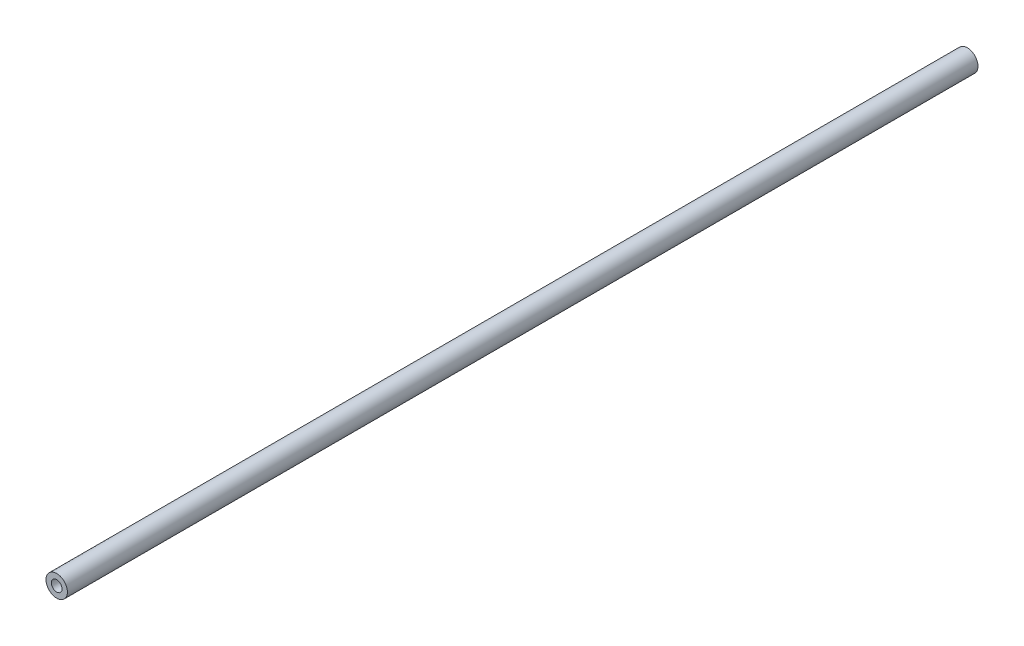
ISO-10303-21;
HEADER;
FILE_DESCRIPTION(('STEP AP214'),'2;1');
FILE_NAME('part.step','',(''),(''),'','','');
FILE_SCHEMA(('AUTOMOTIVE_DESIGN { 1 0 10303 214 1 1 1 1 }'));
ENDSEC;
DATA;
#1=APPLICATION_CONTEXT('core data for automotive mechanical design processes');
#2=APPLICATION_PROTOCOL_DEFINITION('international standard','automotive_design',2000,#1);
#3=PRODUCT_CONTEXT('',#1,'mechanical');
#4=PRODUCT('Part','Part','',(#3));
#5=PRODUCT_RELATED_PRODUCT_CATEGORY('part','',(#4));
#6=PRODUCT_DEFINITION_FORMATION('','',#4);
#7=PRODUCT_DEFINITION_CONTEXT('part definition',#1,'design');
#8=PRODUCT_DEFINITION('design','',#6,#7);
#9=PRODUCT_DEFINITION_SHAPE('','',#8);
#10=(LENGTH_UNIT() NAMED_UNIT(*) SI_UNIT(.MILLI.,.METRE.));
#11=(NAMED_UNIT(*) PLANE_ANGLE_UNIT() SI_UNIT($,.RADIAN.));
#12=(NAMED_UNIT(*) SI_UNIT($,.STERADIAN.) SOLID_ANGLE_UNIT());
#13=UNCERTAINTY_MEASURE_WITH_UNIT(LENGTH_MEASURE(1.E-05),#10,'distance_accuracy_value','');
#14=(GEOMETRIC_REPRESENTATION_CONTEXT(3) GLOBAL_UNCERTAINTY_ASSIGNED_CONTEXT((#13)) GLOBAL_UNIT_ASSIGNED_CONTEXT((#10,
#11,#12)) REPRESENTATION_CONTEXT('',''));
#15=CARTESIAN_POINT('',(0.,0.,0.));
#16=DIRECTION('',(0.,0.,1.));
#17=DIRECTION('',(1.,0.,0.));
#18=AXIS2_PLACEMENT_3D('',#15,#16,#17);
#19=CARTESIAN_POINT('',(0.,0.,42.5));
#20=DIRECTION('',(0.,0.,1.));
#21=DIRECTION('',(1.,0.,0.));
#22=AXIS2_PLACEMENT_3D('',#19,#20,#21);
#23=PLANE('',#22);
#24=CARTESIAN_POINT('',(0.,0.,42.5));
#25=DIRECTION('',(0.,0.,1.));
#26=DIRECTION('',(1.,0.,0.));
#27=AXIS2_PLACEMENT_3D('',#24,#25,#26);
#28=CIRCLE('',#27,1.);
#29=CARTESIAN_POINT('',(1.,0.,42.5));
#30=VERTEX_POINT('',#29);
#31=EDGE_CURVE('E10',#30,#30,#28,.T.);
#32=ORIENTED_EDGE('',*,*,#31,.T.);
#33=EDGE_LOOP('',(#32));
#34=FACE_BOUND('',#33,.T.);
#35=CARTESIAN_POINT('',(0.,0.,42.5));
#36=DIRECTION('',(0.,0.,1.));
#37=DIRECTION('',(1.,0.,0.));
#38=AXIS2_PLACEMENT_3D('',#35,#36,#37);
#39=CIRCLE('',#38,0.5);
#40=CARTESIAN_POINT('',(0.5,0.,42.5));
#41=VERTEX_POINT('',#40);
#42=EDGE_CURVE('E48',#41,#41,#39,.T.);
#43=ORIENTED_EDGE('',*,*,#42,.F.);
#44=EDGE_LOOP('',(#43));
#45=FACE_BOUND('',#44,.T.);
#46=ADVANCED_FACE('F40',(#34,#45),#23,.T.);
#47=CARTESIAN_POINT('',(0.,0.,-42.5));
#48=DIRECTION('',(0.,0.,1.));
#49=DIRECTION('',(1.,0.,0.));
#50=AXIS2_PLACEMENT_3D('',#47,#48,#49);
#51=PLANE('',#50);
#52=CARTESIAN_POINT('',(0.,0.,-42.5));
#53=DIRECTION('',(0.,0.,1.));
#54=DIRECTION('',(1.,0.,0.));
#55=AXIS2_PLACEMENT_3D('',#52,#53,#54);
#56=CIRCLE('',#55,1.);
#57=CARTESIAN_POINT('',(1.,0.,-42.5));
#58=VERTEX_POINT('',#57);
#59=EDGE_CURVE('E41',#58,#58,#56,.T.);
#60=ORIENTED_EDGE('',*,*,#59,.F.);
#61=EDGE_LOOP('',(#60));
#62=FACE_BOUND('',#61,.T.);
#63=CARTESIAN_POINT('',(0.,0.,-42.5));
#64=DIRECTION('',(0.,0.,1.));
#65=DIRECTION('',(1.,0.,0.));
#66=AXIS2_PLACEMENT_3D('',#63,#64,#65);
#67=CIRCLE('',#66,0.5);
#68=CARTESIAN_POINT('',(0.5,0.,-42.5));
#69=VERTEX_POINT('',#68);
#70=EDGE_CURVE('E49',#69,#69,#67,.T.);
#71=ORIENTED_EDGE('',*,*,#70,.T.);
#72=EDGE_LOOP('',(#71));
#73=FACE_BOUND('',#72,.T.);
#74=ADVANCED_FACE('F58',(#62,#73),#51,.F.);
#75=CARTESIAN_POINT('',(0.,0.,42.5));
#76=DIRECTION('',(0.,0.,-1.));
#77=DIRECTION('',(-1.,0.,0.));
#78=AXIS2_PLACEMENT_3D('',#75,#76,#77);
#79=CYLINDRICAL_SURFACE('',#78,1.);
#80=ORIENTED_EDGE('',*,*,#31,.F.);
#81=EDGE_LOOP('',(#80));
#82=FACE_BOUND('',#81,.T.);
#83=ORIENTED_EDGE('',*,*,#59,.T.);
#84=EDGE_LOOP('',(#83));
#85=FACE_BOUND('',#84,.T.);
#86=ADVANCED_FACE('F39',(#82,#85),#79,.T.);
#87=CARTESIAN_POINT('',(0.,0.,42.5));
#88=DIRECTION('',(0.,0.,-1.));
#89=DIRECTION('',(-1.,0.,0.));
#90=AXIS2_PLACEMENT_3D('',#87,#88,#89);
#91=CYLINDRICAL_SURFACE('',#90,0.5);
#92=ORIENTED_EDGE('',*,*,#42,.T.);
#93=EDGE_LOOP('',(#92));
#94=FACE_BOUND('',#93,.T.);
#95=ORIENTED_EDGE('',*,*,#70,.F.);
#96=EDGE_LOOP('',(#95));
#97=FACE_BOUND('',#96,.T.);
#98=ADVANCED_FACE('F57',(#94,#97),#91,.F.);
#99=CLOSED_SHELL('',(#46,#74,#86,#98));
#100=MANIFOLD_SOLID_BREP('B2',#99);
#101=ADVANCED_BREP_SHAPE_REPRESENTATION('',(#18,#100),#14);
#102=SHAPE_DEFINITION_REPRESENTATION(#9,#101);
ENDSEC;
END-ISO-10303-21;
